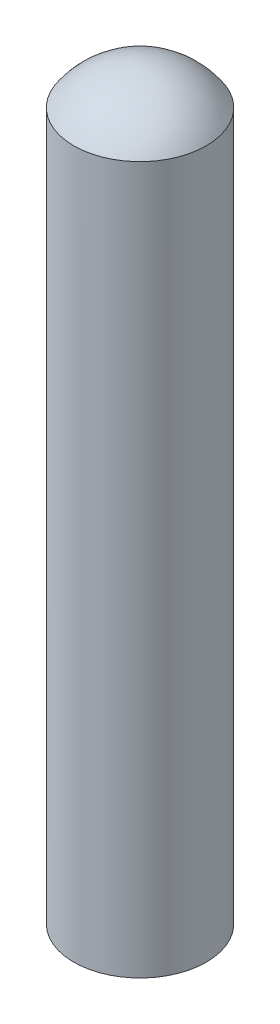
ISO-10303-21;
HEADER;
FILE_DESCRIPTION(('STEP AP214'),'2;1');
FILE_NAME('part.step','',(''),(''),'','','');
FILE_SCHEMA(('AUTOMOTIVE_DESIGN { 1 0 10303 214 1 1 1 1 }'));
ENDSEC;
DATA;
#1=APPLICATION_CONTEXT('core data for automotive mechanical design processes');
#2=APPLICATION_PROTOCOL_DEFINITION('international standard','automotive_design',2000,#1);
#3=PRODUCT_CONTEXT('',#1,'mechanical');
#4=PRODUCT('Part','Part','',(#3));
#5=PRODUCT_RELATED_PRODUCT_CATEGORY('part','',(#4));
#6=PRODUCT_DEFINITION_FORMATION('','',#4);
#7=PRODUCT_DEFINITION_CONTEXT('part definition',#1,'design');
#8=PRODUCT_DEFINITION('design','',#6,#7);
#9=PRODUCT_DEFINITION_SHAPE('','',#8);
#10=(LENGTH_UNIT() NAMED_UNIT(*) SI_UNIT(.MILLI.,.METRE.));
#11=(NAMED_UNIT(*) PLANE_ANGLE_UNIT() SI_UNIT($,.RADIAN.));
#12=(NAMED_UNIT(*) SI_UNIT($,.STERADIAN.) SOLID_ANGLE_UNIT());
#13=UNCERTAINTY_MEASURE_WITH_UNIT(LENGTH_MEASURE(1.E-05),#10,'distance_accuracy_value','');
#14=(GEOMETRIC_REPRESENTATION_CONTEXT(3) GLOBAL_UNCERTAINTY_ASSIGNED_CONTEXT((#13)) GLOBAL_UNIT_ASSIGNED_CONTEXT((#10,
#11,#12)) REPRESENTATION_CONTEXT('',''));
#15=CARTESIAN_POINT('',(0.,0.,0.));
#16=DIRECTION('',(0.,0.,1.));
#17=DIRECTION('',(1.,0.,0.));
#18=AXIS2_PLACEMENT_3D('',#15,#16,#17);
#19=CARTESIAN_POINT('',(2.9765625,29.7552027476323,0.));
#20=DIRECTION('',(0.,-1.,0.));
#21=DIRECTION('',(-1.,0.,0.));
#22=AXIS2_PLACEMENT_3D('',#19,#20,#21);
#23=SPHERICAL_SURFACE('',#22,3.58317462516972);
#24=CARTESIAN_POINT('',(2.97656249999989,31.75,0.));
#25=DIRECTION('',(0.,-1.,0.));
#26=DIRECTION('',(1.,0.,0.));
#27=AXIS2_PLACEMENT_3D('',#24,#25,#26);
#28=CIRCLE('',#27,2.97656249999989);
#29=CARTESIAN_POINT('',(5.95312499999978,31.75,0.));
#30=VERTEX_POINT('',#29);
#31=EDGE_CURVE('E10',#30,#30,#28,.T.);
#32=ORIENTED_EDGE('',*,*,#31,.F.);
#33=EDGE_LOOP('',(#32));
#34=FACE_BOUND('',#33,.T.);
#35=ADVANCED_FACE('F41',(#34),#23,.T.);
#36=CARTESIAN_POINT('',(2.9765625,0.,0.));
#37=DIRECTION('',(0.,-1.,0.));
#38=DIRECTION('',(1.,0.,0.));
#39=AXIS2_PLACEMENT_3D('',#36,#37,#38);
#40=CYLINDRICAL_SURFACE('',#39,2.97656249999995);
#41=ORIENTED_EDGE('',*,*,#31,.T.);
#42=EDGE_LOOP('',(#41));
#43=FACE_BOUND('',#42,.T.);
#44=CARTESIAN_POINT('',(2.9765625,0.,0.));
#45=DIRECTION('',(0.,-1.,0.));
#46=DIRECTION('',(1.,0.,0.));
#47=AXIS2_PLACEMENT_3D('',#44,#45,#46);
#48=CIRCLE('',#47,2.9765625);
#49=CARTESIAN_POINT('',(5.953125,0.,0.));
#50=VERTEX_POINT('',#49);
#51=EDGE_CURVE('E48',#50,#50,#48,.T.);
#52=ORIENTED_EDGE('',*,*,#51,.F.);
#53=EDGE_LOOP('',(#52));
#54=FACE_BOUND('',#53,.T.);
#55=ADVANCED_FACE('F57',(#43,#54),#40,.T.);
#56=CARTESIAN_POINT('',(0.,0.,0.));
#57=DIRECTION('',(0.,1.,0.));
#58=DIRECTION('',(-1.,0.,0.));
#59=AXIS2_PLACEMENT_3D('',#56,#57,#58);
#60=PLANE('',#59);
#61=ORIENTED_EDGE('',*,*,#51,.T.);
#62=EDGE_LOOP('',(#61));
#63=FACE_BOUND('',#62,.T.);
#64=ADVANCED_FACE('F55',(#63),#60,.F.);
#65=CLOSED_SHELL('',(#35,#55,#64));
#66=MANIFOLD_SOLID_BREP('B2',#65);
#67=ADVANCED_BREP_SHAPE_REPRESENTATION('',(#18,#66),#14);
#68=SHAPE_DEFINITION_REPRESENTATION(#9,#67);
ENDSEC;
END-ISO-10303-21;
